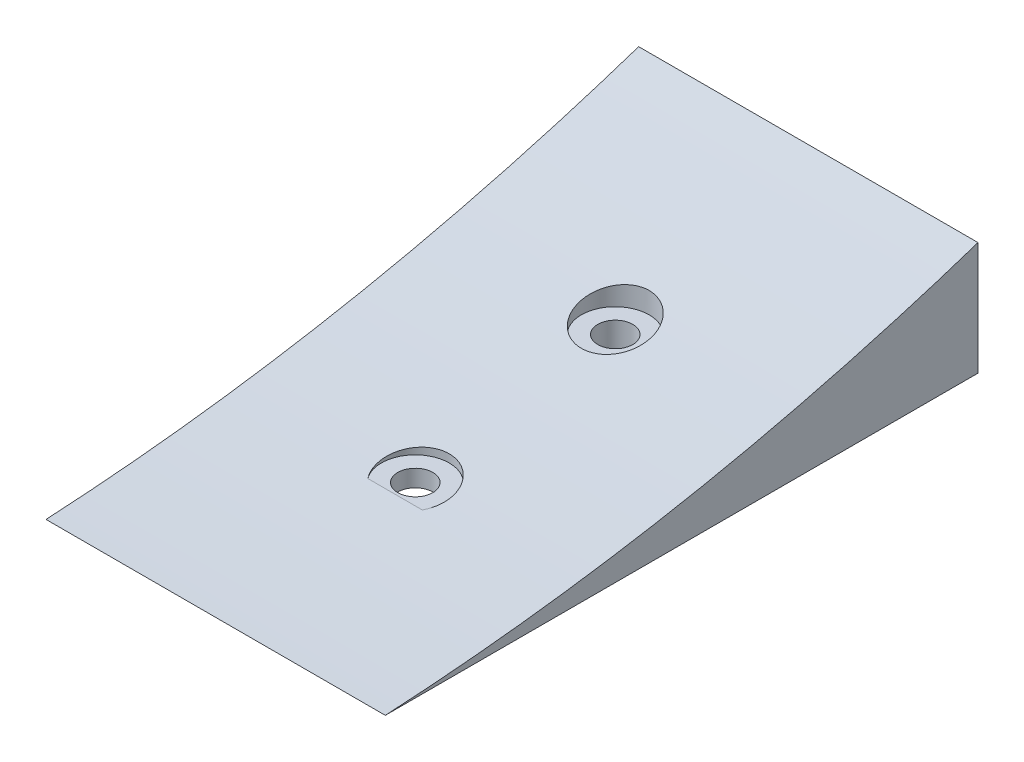
ISO-10303-21;
HEADER;
FILE_DESCRIPTION(('STEP AP214'),'2;1');
FILE_NAME('part.step','',(''),(''),'','','');
FILE_SCHEMA(('AUTOMOTIVE_DESIGN { 1 0 10303 214 1 1 1 1 }'));
ENDSEC;
DATA;
#1=APPLICATION_CONTEXT('core data for automotive mechanical design processes');
#2=APPLICATION_PROTOCOL_DEFINITION('international standard','automotive_design',2000,#1);
#3=PRODUCT_CONTEXT('',#1,'mechanical');
#4=PRODUCT('Part','Part','',(#3));
#5=PRODUCT_RELATED_PRODUCT_CATEGORY('part','',(#4));
#6=PRODUCT_DEFINITION_FORMATION('','',#4);
#7=PRODUCT_DEFINITION_CONTEXT('part definition',#1,'design');
#8=PRODUCT_DEFINITION('design','',#6,#7);
#9=PRODUCT_DEFINITION_SHAPE('','',#8);
#10=(LENGTH_UNIT() NAMED_UNIT(*) SI_UNIT(.MILLI.,.METRE.));
#11=(NAMED_UNIT(*) PLANE_ANGLE_UNIT() SI_UNIT($,.RADIAN.));
#12=(NAMED_UNIT(*) SI_UNIT($,.STERADIAN.) SOLID_ANGLE_UNIT());
#13=UNCERTAINTY_MEASURE_WITH_UNIT(LENGTH_MEASURE(1.E-05),#10,'distance_accuracy_value','');
#14=(GEOMETRIC_REPRESENTATION_CONTEXT(3) GLOBAL_UNCERTAINTY_ASSIGNED_CONTEXT((#13)) GLOBAL_UNIT_ASSIGNED_CONTEXT((#10,
#11,#12)) REPRESENTATION_CONTEXT('',''));
#15=CARTESIAN_POINT('',(0.,0.,0.));
#16=DIRECTION('',(0.,0.,1.));
#17=DIRECTION('',(1.,0.,0.));
#18=AXIS2_PLACEMENT_3D('',#15,#16,#17);
#19=CARTESIAN_POINT('',(0.,10.,0.));
#20=DIRECTION('',(1.,0.,0.));
#21=DIRECTION('',(0.,0.,-1.));
#22=AXIS2_PLACEMENT_3D('',#19,#20,#21);
#23=PLANE('',#22);
#24=DIRECTION('',(0.,0.,1.));
#25=VECTOR('',#24,1.);
#26=CARTESIAN_POINT('',(0.,0.,0.));
#27=LINE('',#26,#25);
#28=CARTESIAN_POINT('',(0.,0.,-52.4));
#29=VERTEX_POINT('',#28);
#30=CARTESIAN_POINT('',(0.,0.,0.));
#31=VERTEX_POINT('',#30);
#32=EDGE_CURVE('E122',#29,#31,#27,.T.);
#33=ORIENTED_EDGE('',*,*,#32,.T.);
#34=CARTESIAN_POINT('',(0.,0.,0.));
#35=CARTESIAN_POINT('',(0.,1.46483217318172,-26.7975723931708));
#36=CARTESIAN_POINT('',(0.,10.,-52.4));
#37=B_SPLINE_CURVE_WITH_KNOTS('',2,(#34,#35,#36),.UNSPECIFIED.,.F.,.F.,(3,3),(0.,1.),.UNSPECIFIED.);
#38=CARTESIAN_POINT('',(0.,10.,-52.4));
#39=VERTEX_POINT('',#38);
#40=EDGE_CURVE('E107',#31,#39,#37,.T.);
#41=ORIENTED_EDGE('',*,*,#40,.T.);
#42=DIRECTION('',(0.,-1.,0.));
#43=VECTOR('',#42,1.);
#44=CARTESIAN_POINT('',(0.,10.,-52.4));
#45=LINE('',#44,#43);
#46=EDGE_CURVE('E112',#39,#29,#45,.T.);
#47=ORIENTED_EDGE('',*,*,#46,.T.);
#48=EDGE_LOOP('',(#33,#41,#47));
#49=FACE_BOUND('',#48,.T.);
#50=ADVANCED_FACE('F33',(#49),#23,.F.);
#51=CARTESIAN_POINT('',(30.,10.,0.));
#52=DIRECTION('',(-1.,0.,0.));
#53=DIRECTION('',(0.,0.,1.));
#54=AXIS2_PLACEMENT_3D('',#51,#52,#53);
#55=PLANE('',#54);
#56=DIRECTION('',(0.,-1.,0.));
#57=VECTOR('',#56,1.);
#58=CARTESIAN_POINT('',(30.,10.,-52.4));
#59=LINE('',#58,#57);
#60=CARTESIAN_POINT('',(30.,10.,-52.4));
#61=VERTEX_POINT('',#60);
#62=CARTESIAN_POINT('',(30.,0.,-52.4));
#63=VERTEX_POINT('',#62);
#64=EDGE_CURVE('E46',#61,#63,#59,.T.);
#65=ORIENTED_EDGE('',*,*,#64,.F.);
#66=CARTESIAN_POINT('',(30.,0.,0.));
#67=CARTESIAN_POINT('',(30.,1.46483217318172,-26.7975723931708));
#68=CARTESIAN_POINT('',(30.,10.,-52.4));
#69=B_SPLINE_CURVE_WITH_KNOTS('',2,(#66,#67,#68),.UNSPECIFIED.,.F.,.F.,(3,3),(0.,1.),.UNSPECIFIED.);
#70=CARTESIAN_POINT('',(30.,0.,0.));
#71=VERTEX_POINT('',#70);
#72=EDGE_CURVE('E98',#71,#61,#69,.T.);
#73=ORIENTED_EDGE('',*,*,#72,.F.);
#74=DIRECTION('',(0.,0.,-1.));
#75=VECTOR('',#74,1.);
#76=CARTESIAN_POINT('',(30.,0.,0.));
#77=LINE('',#76,#75);
#78=EDGE_CURVE('E111',#71,#63,#77,.T.);
#79=ORIENTED_EDGE('',*,*,#78,.T.);
#80=EDGE_LOOP('',(#65,#73,#79));
#81=FACE_BOUND('',#80,.T.);
#82=ADVANCED_FACE('F110',(#81),#55,.F.);
#83=CARTESIAN_POINT('',(0.,10.,-52.4));
#84=DIRECTION('',(0.,0.,1.));
#85=DIRECTION('',(1.,0.,0.));
#86=AXIS2_PLACEMENT_3D('',#83,#84,#85);
#87=PLANE('',#86);
#88=DIRECTION('',(-1.,0.,0.));
#89=VECTOR('',#88,1.);
#90=CARTESIAN_POINT('',(0.,0.,-52.4));
#91=LINE('',#90,#89);
#92=EDGE_CURVE('E60',#63,#29,#91,.T.);
#93=ORIENTED_EDGE('',*,*,#92,.T.);
#94=ORIENTED_EDGE('',*,*,#46,.F.);
#95=DIRECTION('',(-1.,0.,0.));
#96=VECTOR('',#95,1.);
#97=CARTESIAN_POINT('',(0.,10.,-52.4));
#98=LINE('',#97,#96);
#99=EDGE_CURVE('E101',#61,#39,#98,.T.);
#100=ORIENTED_EDGE('',*,*,#99,.F.);
#101=ORIENTED_EDGE('',*,*,#64,.T.);
#102=EDGE_LOOP('',(#93,#94,#100,#101));
#103=FACE_BOUND('',#102,.T.);
#104=ADVANCED_FACE('F114',(#103),#87,.F.);
#105=CARTESIAN_POINT('',(0.,0.,0.));
#106=DIRECTION('',(0.,-1.,0.));
#107=DIRECTION('',(0.,0.,-1.));
#108=AXIS2_PLACEMENT_3D('',#105,#106,#107);
#109=PLANE('',#108);
#110=CARTESIAN_POINT('',(15.,0.,-35.33));
#111=DIRECTION('',(0.,-1.,0.));
#112=DIRECTION('',(0.,0.,-1.));
#113=AXIS2_PLACEMENT_3D('',#110,#111,#112);
#114=CIRCLE('',#113,1.55);
#115=CARTESIAN_POINT('',(15.,0.,-36.88));
#116=VERTEX_POINT('',#115);
#117=EDGE_CURVE('E108',#116,#116,#114,.T.);
#118=ORIENTED_EDGE('',*,*,#117,.F.);
#119=EDGE_LOOP('',(#118));
#120=FACE_BOUND('',#119,.T.);
#121=CARTESIAN_POINT('',(15.,0.,-17.65));
#122=DIRECTION('',(0.,-1.,0.));
#123=DIRECTION('',(0.,0.,-1.));
#124=AXIS2_PLACEMENT_3D('',#121,#122,#123);
#125=CIRCLE('',#124,1.55);
#126=CARTESIAN_POINT('',(15.,0.,-19.2));
#127=VERTEX_POINT('',#126);
#128=EDGE_CURVE('E130',#127,#127,#125,.T.);
#129=ORIENTED_EDGE('',*,*,#128,.F.);
#130=EDGE_LOOP('',(#129));
#131=FACE_BOUND('',#130,.T.);
#132=ORIENTED_EDGE('',*,*,#32,.F.);
#133=ORIENTED_EDGE('',*,*,#92,.F.);
#134=ORIENTED_EDGE('',*,*,#78,.F.);
#135=DIRECTION('',(1.,0.,0.));
#136=VECTOR('',#135,1.);
#137=CARTESIAN_POINT('',(0.,0.,0.));
#138=LINE('',#137,#136);
#139=EDGE_CURVE('E104',#31,#71,#138,.T.);
#140=ORIENTED_EDGE('',*,*,#139,.F.);
#141=EDGE_LOOP('',(#132,#133,#134,#140));
#142=FACE_BOUND('',#141,.T.);
#143=ADVANCED_FACE('F92',(#120,#131,#142),#109,.T.);
#144=DIRECTION('',(1.,0.,0.));
#145=VECTOR('',#144,1.);
#146=SURFACE_OF_LINEAR_EXTRUSION('',#37,#145);
#147=DIRECTION('',(1.,0.,0.));
#148=VECTOR('',#147,1.);
#149=CARTESIAN_POINT('',(0.,1.5,-15.8584519694367));
#150=LINE('',#149,#148);
#151=CARTESIAN_POINT('',(17.4063157843859,1.5,-15.8584519694367));
#152=VERTEX_POINT('',#151);
#153=CARTESIAN_POINT('',(12.5936842156141,1.5,-15.8584519694367));
#154=VERTEX_POINT('',#153);
#155=EDGE_CURVE('E79',#152,#154,#150,.F.);
#156=ORIENTED_EDGE('',*,*,#155,.T.);
#157=CARTESIAN_POINT('',(12.5936842156141,1.5,-15.8584519694367));
#158=CARTESIAN_POINT('',(12.5428656586624,1.50921584644328,-15.9266952350148));
#159=CARTESIAN_POINT('',(12.4949878869282,1.51875721333754,-15.9970772347503));
#160=CARTESIAN_POINT('',(12.4054113743887,1.53843018439872,-16.1415824943681));
#161=CARTESIAN_POINT('',(12.3637120765417,1.54856173524066,-16.2157054161657));
#162=CARTESIAN_POINT('',(12.2868172003703,1.56934608838711,-16.3670969483702));
#163=CARTESIAN_POINT('',(12.251615487735,1.57999838691333,-16.4443625068475));
#164=CARTESIAN_POINT('',(12.1879039660042,1.60176235635777,-16.6015176882954));
#165=CARTESIAN_POINT('',(12.1593941545142,1.61287402711161,-16.6814073103271));
#166=CARTESIAN_POINT('',(12.0842003005566,1.64680212650276,-16.9242179986155));
#167=CARTESIAN_POINT('',(12.0478032519005,1.67022479329615,-17.0903768440814));
#168=CARTESIAN_POINT('',(12.0035616126467,1.71801355647811,-17.4262075460633));
#169=CARTESIAN_POINT('',(11.9957144810499,1.74237956871198,-17.5958790885906));
#170=CARTESIAN_POINT('',(12.0087277094615,1.79152367363727,-17.9349608823447));
#171=CARTESIAN_POINT('',(12.0297333978676,1.81630322683634,-18.1043654763324));
#172=CARTESIAN_POINT('',(12.1001404985521,1.86542518092064,-18.437254244342));
#173=CARTESIAN_POINT('',(12.1495460676216,1.88976751727398,-18.600737547961));
#174=CARTESIAN_POINT('',(12.2755093686103,1.93729520705006,-18.9173682133374));
#175=CARTESIAN_POINT('',(12.3521082815158,1.9604787445311,-19.0704994771846));
#176=CARTESIAN_POINT('',(12.5303552879193,2.00488686107001,-19.3617235165053));
#177=CARTESIAN_POINT('',(12.6320014691809,2.0261115895034,-19.4998174388462));
#178=CARTESIAN_POINT('',(12.8569007687183,2.06575693228134,-19.756190386392));
#179=CARTESIAN_POINT('',(12.9800286807176,2.08419269905784,-19.8745768630236));
#180=CARTESIAN_POINT('',(13.244849384672,2.11773851550883,-20.0889469526342));
#181=CARTESIAN_POINT('',(13.3865414178943,2.13284870103528,-20.1849314807557));
#182=CARTESIAN_POINT('',(13.6828026000245,2.15902865741914,-20.3506448019885));
#183=CARTESIAN_POINT('',(13.8372126955295,2.17014110486035,-20.4206511870503));
#184=CARTESIAN_POINT('',(14.1558278413402,2.18813051009957,-20.5337377024873));
#185=CARTESIAN_POINT('',(14.320032168484,2.19500778018039,-20.5768198181397));
#186=CARTESIAN_POINT('',(14.6516487206042,2.20420679020125,-20.634403672983));
#187=CARTESIAN_POINT('',(14.8190063404277,2.20657745263682,-20.6492123486316));
#188=CARTESIAN_POINT('',(15.153848500953,2.20681964099681,-20.6507262461003));
#189=CARTESIAN_POINT('',(15.3213330365889,2.20469133792336,-20.6374325360698));
#190=CARTESIAN_POINT('',(15.6508309576127,2.19604004447083,-20.5832851400289));
#191=CARTESIAN_POINT('',(15.8128668517725,2.18953831902175,-20.5425648094678));
#192=CARTESIAN_POINT('',(16.1277578432003,2.17241002848718,-20.4349325083044));
#193=CARTESIAN_POINT('',(16.280612787444,2.16178339467145,-20.3680201012833));
#194=CARTESIAN_POINT('',(16.5734891974275,2.13675084777493,-20.2096784781845));
#195=CARTESIAN_POINT('',(16.7134575262714,2.12233015662256,-20.118153362662));
#196=CARTESIAN_POINT('',(16.9760568729877,2.09025092039349,-19.913387982173));
#197=CARTESIAN_POINT('',(17.0986873794917,2.07259227985074,-19.8001470769446));
#198=CARTESIAN_POINT('',(17.3245096755595,2.03445003084073,-19.5539040786118));
#199=CARTESIAN_POINT('',(17.4274861797418,2.01393896842482,-19.4207088288997));
#200=CARTESIAN_POINT('',(17.609660949545,1.97092185844357,-19.1392219677846));
#201=CARTESIAN_POINT('',(17.6888561944578,1.94841555791191,-18.9909284417913));
#202=CARTESIAN_POINT('',(17.822125197145,1.90186414549719,-18.6816414073678));
#203=CARTESIAN_POINT('',(17.875904212639,1.87780448991616,-18.5205230618939));
#204=CARTESIAN_POINT('',(17.9555468393725,1.82912630274967,-18.1916308352775));
#205=CARTESIAN_POINT('',(17.9814137676465,1.80450783792745,-18.0238577474329));
#206=CARTESIAN_POINT('',(18.0046242815642,1.75527048173654,-17.6852265064746));
#207=CARTESIAN_POINT('',(18.0017778780788,1.73065266678315,-17.5143552818565));
#208=CARTESIAN_POINT('',(17.9671004502628,1.68225610705812,-17.1753239148758));
#209=CARTESIAN_POINT('',(17.9352621982519,1.65847757305516,-17.0071644591979));
#210=CARTESIAN_POINT('',(17.8647496663913,1.62308813092542,-16.7546507125838));
#211=CARTESIAN_POINT('',(17.8360299777871,1.61093134421571,-16.6674723703875));
#212=CARTESIAN_POINT('',(17.7706919379743,1.58713501164367,-16.4960189454079));
#213=CARTESIAN_POINT('',(17.7340729743425,1.57549550597006,-16.4117440883169));
#214=CARTESIAN_POINT('',(17.6531540781852,1.55280532504552,-16.2467062325327));
#215=CARTESIAN_POINT('',(17.6088410113615,1.54175569962829,-16.1659495393398));
#216=CARTESIAN_POINT('',(17.5129416157205,1.52034329938619,-16.0087756371168));
#217=CARTESIAN_POINT('',(17.4613549276129,1.50998055852811,-15.9323586427135));
#218=CARTESIAN_POINT('',(17.4063157843859,1.5,-15.8584519694367));
#219=B_SPLINE_CURVE_WITH_KNOTS('',3,(#157,#158,#159,#160,#161,#162,#163,#164,#165,#166,#167,
#168,#169,#170,#171,#172,#173,#174,#175,#176,#177,#178,#179,#180,#181,#182,#183,#184,#185,#186,
#187,#188,#189,#190,#191,#192,#193,#194,#195,#196,#197,#198,#199,#200,#201,#202,#203,#204,#205,
#206,#207,#208,#209,#210,#211,#212,#213,#214,#215,#216,#217,#218),.UNSPECIFIED.,.F.,.F.,(4,2,2,
2,2,2,2,2,2,2,2,2,2,2,2,2,2,2,2,2,2,2,2,2,2,2,2,2,2,2,4),(0.,0.256664941409219,
0.513306728199344,0.769704968508425,1.02610311707711,1.53857842383788,2.05100811816777,
2.56602834948328,3.0811239817076,3.59700301417578,4.1128426740013,4.62577050832913,
5.13867738536136,5.64593393761771,6.15315308259069,6.65483383247216,7.1564955142067,
7.65573542673489,8.1549836580785,8.65620604384817,9.15744320978214,9.66389002832648,
10.1704011488251,10.6826500923427,11.1948381541856,11.710417451022,12.2261253171988,
12.5035667252268,12.7810296507553,13.0589709644538,13.3369260122534),.UNSPECIFIED.);
#220=EDGE_CURVE('E11',#154,#152,#219,.T.);
#221=ORIENTED_EDGE('',*,*,#220,.T.);
#222=EDGE_LOOP('',(#156,#221));
#223=FACE_BOUND('',#222,.T.);
#224=CARTESIAN_POINT('',(15.,5.86623354935667,-38.33));
#225=CARTESIAN_POINT('',(15.1647180601281,5.86623133201718,-38.3299920514101));
#226=CARTESIAN_POINT('',(15.3295588223282,5.86276290509084,-38.3163811085625));
#227=CARTESIAN_POINT('',(15.6546272949316,5.84901205025036,-38.2623499892137));
#228=CARTESIAN_POINT('',(15.814849109084,5.83872128324089,-38.2218970030438));
#229=CARTESIAN_POINT('',(16.1258453758175,5.81173294746736,-38.1155764646656));
#230=CARTESIAN_POINT('',(16.2766305595634,5.79504281581044,-38.0497384135546));
#231=CARTESIAN_POINT('',(16.5648282305035,5.75587458805418,-37.894777831243));
#232=CARTESIAN_POINT('',(16.702243215074,5.73339757573848,-37.8056596599646));
#233=CARTESIAN_POINT('',(16.9620337979301,5.68308471154575,-37.6054538007149));
#234=CARTESIAN_POINT('',(17.0841721130658,5.65517829189708,-37.4940762145607));
#235=CARTESIAN_POINT('',(17.3081098258104,5.5951450239251,-37.2534486322229));
#236=CARTESIAN_POINT('',(17.4099058571958,5.5630174785491,-37.124195684018));
#237=CARTESIAN_POINT('',(17.5933887024091,5.49455990584767,-36.847460368217));
#238=CARTESIAN_POINT('',(17.6744068825233,5.45813503876609,-36.6995581086295));
#239=CARTESIAN_POINT('',(17.8104526088605,5.38298784895169,-36.3927898028971));
#240=CARTESIAN_POINT('',(17.865476420993,5.34426519704084,-36.2339221853331));
#241=CARTESIAN_POINT('',(17.9492998775235,5.2646395273565,-35.9054000413593));
#242=CARTESIAN_POINT('',(17.9774006968654,5.22370613129331,-35.7355742830924));
#243=CARTESIAN_POINT('',(18.0042253223181,5.1417711920233,-35.3936273446507));
#244=CARTESIAN_POINT('',(18.0029467546644,5.1007696435776,-35.2215059801208));
#245=CARTESIAN_POINT('',(17.9708101101742,5.01940517509964,-34.8779298874495));
#246=CARTESIAN_POINT('',(17.9396380176256,4.9790536629401,-34.7065016553252));
#247=CARTESIAN_POINT('',(17.8479465903462,4.90056652147541,-34.3711379540951));
#248=CARTESIAN_POINT('',(17.7874276891554,4.86243085944484,-34.2072023743396));
#249=CARTESIAN_POINT('',(17.6390909378575,4.7897154118385,-33.8929348514116));
#250=CARTESIAN_POINT('',(17.5514877615586,4.75511041419295,-33.742507533346));
#251=CARTESIAN_POINT('',(17.3510772105857,4.69008003201684,-33.4584670698052));
#252=CARTESIAN_POINT('',(17.2382725772658,4.65965419346826,-33.3248520979925));
#253=CARTESIAN_POINT('',(16.9931862830362,4.60443115663873,-33.0813531726286));
#254=CARTESIAN_POINT('',(16.8613706254516,4.57952787858792,-32.9710243946838));
#255=CARTESIAN_POINT('',(16.580212141779,4.53522937041781,-32.7741502717133));
#256=CARTESIAN_POINT('',(16.4308718727654,4.51583333812679,-32.687601463016));
#257=CARTESIAN_POINT('',(16.1229029092856,4.48350080673299,-32.5430106916333));
#258=CARTESIAN_POINT('',(15.9645970170077,4.4704158433955,-32.4843141218002));
#259=CARTESIAN_POINT('',(15.6400285935215,4.45035800640151,-32.3942347928584));
#260=CARTESIAN_POINT('',(15.4737670055399,4.44338441006606,-32.3628488042327));
#261=CARTESIAN_POINT('',(15.1412578525229,4.43581005194479,-32.3287549573548));
#262=CARTESIAN_POINT('',(14.9750651645118,4.43509555396538,-32.3255352809977));
#263=CARTESIAN_POINT('',(14.6445155679246,4.43976020652274,-32.3465367650942));
#264=CARTESIAN_POINT('',(14.4801585681721,4.4451390530386,-32.3707565564848));
#265=CARTESIAN_POINT('',(14.1588030841802,4.46180311367164,-32.445650772375));
#266=CARTESIAN_POINT('',(14.0017711463682,4.47305785529096,-32.4961887071181));
#267=CARTESIAN_POINT('',(13.6985134188992,4.50116078036305,-32.6220327950152));
#268=CARTESIAN_POINT('',(13.5522879241297,4.51800911638564,-32.6973396237602));
#269=CARTESIAN_POINT('',(13.2732622305162,4.55704810417121,-32.8712096483409));
#270=CARTESIAN_POINT('',(13.1406001289863,4.57928716751214,-32.9699834202109));
#271=CARTESIAN_POINT('',(12.8937296358278,4.62845258788932,-33.1874107134979));
#272=CARTESIAN_POINT('',(12.7795229264498,4.65537937175767,-33.3060660451583));
#273=CARTESIAN_POINT('',(12.5702656905927,4.71383944605408,-33.5624243276045));
#274=CARTESIAN_POINT('',(12.47565564043,4.7454558214404,-33.7004677582973));
#275=CARTESIAN_POINT('',(12.3108892886682,4.81205874139401,-33.9897029156088));
#276=CARTESIAN_POINT('',(12.2407360116261,4.84704570211752,-34.1408962655847));
#277=CARTESIAN_POINT('',(12.1250841106864,4.92039754969742,-34.4560881107452));
#278=CARTESIAN_POINT('',(12.0802327565787,4.95882426115884,-34.6203097933221));
#279=CARTESIAN_POINT('',(12.0188854358892,5.03727501045636,-34.9535990983276));
#280=CARTESIAN_POINT('',(12.0023928864958,5.07729924019626,-35.1226673022589));
#281=CARTESIAN_POINT('',(11.9980508224822,5.1586503812481,-35.4642940241613));
#282=CARTESIAN_POINT('',(12.0107560416208,5.1999875597767,-35.6368573630438));
#283=CARTESIAN_POINT('',(12.0656142556037,5.28203622338632,-35.9774021115191));
#284=CARTESIAN_POINT('',(12.1077690292931,5.32274767051939,-36.1453832436953));
#285=CARTESIAN_POINT('',(12.2207593604852,5.40252421295245,-36.4727818216416));
#286=CARTESIAN_POINT('',(12.2917303863104,5.44158055617592,-36.6321547331016));
#287=CARTESIAN_POINT('',(12.4605811919758,5.51659332370008,-36.9367567866568));
#288=CARTESIAN_POINT('',(12.5584586419041,5.55255001605532,-37.0819871519256));
#289=CARTESIAN_POINT('',(12.777027561933,5.61966243856411,-37.3519122900521));
#290=CARTESIAN_POINT('',(12.8973798504619,5.65087842392721,-37.4768664834619));
#291=CARTESIAN_POINT('',(13.1585825426894,5.70799032661177,-37.7047004299778));
#292=CARTESIAN_POINT('',(13.2994350406047,5.73388569974889,-37.8075779251598));
#293=CARTESIAN_POINT('',(13.5934988056734,5.77872781030064,-37.9852732677435));
#294=CARTESIAN_POINT('',(13.7462687715536,5.79784465059536,-38.0607792725214));
#295=CARTESIAN_POINT('',(14.0628551017755,5.82932570382872,-38.1849222942563));
#296=CARTESIAN_POINT('',(14.2266549486511,5.84169977219046,-38.23359852756));
#297=CARTESIAN_POINT('',(14.4930769912232,5.85569587792203,-38.2886168639931));
#298=CARTESIAN_POINT('',(14.5937793317913,5.85964101245016,-38.3041129234673));
#299=CARTESIAN_POINT('',(14.7963054828953,5.86491051289882,-38.324806867146));
#300=CARTESIAN_POINT('',(14.8981292754916,5.86623492068159,-38.330004915846));
#301=CARTESIAN_POINT('',(15.,5.86623354935667,-38.33));
#302=B_SPLINE_CURVE_WITH_KNOTS('',3,(#224,#225,#226,#227,#228,#229,#230,#231,#232,#233,#234,
#235,#236,#237,#238,#239,#240,#241,#242,#243,#244,#245,#246,#247,#248,#249,#250,#251,#252,#253,
#254,#255,#256,#257,#258,#259,#260,#261,#262,#263,#264,#265,#266,#267,#268,#269,#270,#271,#272,
#273,#274,#275,#276,#277,#278,#279,#280,#281,#282,#283,#284,#285,#286,#287,#288,#289,#290,#291,
#292,#293,#294,#295,#296,#297,#298,#299,#300,#301),.UNSPECIFIED.,.T.,.F.,(4,2,2,2,2,2,2,2,2,2,2,
2,2,2,2,2,2,2,2,2,2,2,2,2,2,2,2,2,2,2,2,2,2,2,2,2,2,2,4),(0.,0.493775731833126,
0.988156132076907,1.48196371453017,1.97567888246813,2.47630079255544,2.97700547664747,
3.49222782369932,4.0075241599472,4.53585986352734,5.06423825516439,5.59822848173071,
6.13221081990467,6.66206477951588,7.19186113092501,7.71037359888733,8.2288105028251,
8.73437157735195,9.23987286040043,9.7361690188171,10.2324404161572,10.7261633375371,
11.2198997267158,11.7182460546404,12.2166377823649,12.7252419240141,13.2339089421934,
13.7550586034608,14.2762710579904,14.8074677836164,15.3386965979601,15.8724522377791,
16.4061616725672,16.9323866180124,17.4586653582031,17.970604761951,18.481793879914,
18.7871768780835,19.0925549981715),.UNSPECIFIED.);
#303=CARTESIAN_POINT('',(15.,5.86623354935667,-38.33));
#304=VERTEX_POINT('',#303);
#305=EDGE_CURVE('E96',#304,#304,#302,.T.);
#306=ORIENTED_EDGE('',*,*,#305,.T.);
#307=EDGE_LOOP('',(#306));
#308=FACE_BOUND('',#307,.T.);
#309=ORIENTED_EDGE('',*,*,#72,.T.);
#310=ORIENTED_EDGE('',*,*,#99,.T.);
#311=ORIENTED_EDGE('',*,*,#40,.F.);
#312=ORIENTED_EDGE('',*,*,#139,.T.);
#313=EDGE_LOOP('',(#309,#310,#311,#312));
#314=FACE_BOUND('',#313,.T.);
#315=ADVANCED_FACE('F88',(#223,#308,#314),#146,.F.);
#316=CARTESIAN_POINT('',(15.,14.,-17.65));
#317=DIRECTION('',(0.,-1.,0.));
#318=DIRECTION('',(0.,0.,-1.));
#319=AXIS2_PLACEMENT_3D('',#316,#317,#318);
#320=CYLINDRICAL_SURFACE('',#319,1.55);
#321=CARTESIAN_POINT('',(15.,1.5,-17.65));
#322=DIRECTION('',(0.,-1.,0.));
#323=DIRECTION('',(0.,0.,-1.));
#324=AXIS2_PLACEMENT_3D('',#321,#322,#323);
#325=CIRCLE('',#324,1.55);
#326=CARTESIAN_POINT('',(15.,1.5,-19.2));
#327=VERTEX_POINT('',#326);
#328=EDGE_CURVE('E86',#327,#327,#325,.T.);
#329=ORIENTED_EDGE('',*,*,#328,.F.);
#330=EDGE_LOOP('',(#329));
#331=FACE_BOUND('',#330,.T.);
#332=ORIENTED_EDGE('',*,*,#128,.T.);
#333=EDGE_LOOP('',(#332));
#334=FACE_BOUND('',#333,.T.);
#335=ADVANCED_FACE('F91',(#331,#334),#320,.F.);
#336=CARTESIAN_POINT('',(15.,14.,-35.33));
#337=DIRECTION('',(0.,-1.,0.));
#338=DIRECTION('',(0.,0.,-1.));
#339=AXIS2_PLACEMENT_3D('',#336,#337,#338);
#340=CYLINDRICAL_SURFACE('',#339,1.55);
#341=CARTESIAN_POINT('',(15.,4.,-35.33));
#342=DIRECTION('',(0.,-1.,0.));
#343=DIRECTION('',(0.,0.,-1.));
#344=AXIS2_PLACEMENT_3D('',#341,#342,#343);
#345=CIRCLE('',#344,1.55);
#346=CARTESIAN_POINT('',(15.,4.,-36.88));
#347=VERTEX_POINT('',#346);
#348=EDGE_CURVE('E82',#347,#347,#345,.T.);
#349=ORIENTED_EDGE('',*,*,#348,.F.);
#350=EDGE_LOOP('',(#349));
#351=FACE_BOUND('',#350,.T.);
#352=ORIENTED_EDGE('',*,*,#117,.T.);
#353=EDGE_LOOP('',(#352));
#354=FACE_BOUND('',#353,.T.);
#355=ADVANCED_FACE('F141',(#351,#354),#340,.F.);
#356=CARTESIAN_POINT('',(15.,16.,-35.33));
#357=DIRECTION('',(0.,-1.,0.));
#358=DIRECTION('',(0.,0.,-1.));
#359=AXIS2_PLACEMENT_3D('',#356,#357,#358);
#360=CYLINDRICAL_SURFACE('',#359,3.);
#361=CARTESIAN_POINT('',(15.,4.,-35.33));
#362=DIRECTION('',(0.,-1.,0.));
#363=DIRECTION('',(0.,0.,-1.));
#364=AXIS2_PLACEMENT_3D('',#361,#362,#363);
#365=CIRCLE('',#364,3.);
#366=CARTESIAN_POINT('',(15.,4.,-38.33));
#367=VERTEX_POINT('',#366);
#368=EDGE_CURVE('E131',#367,#367,#365,.T.);
#369=ORIENTED_EDGE('',*,*,#368,.T.);
#370=EDGE_LOOP('',(#369));
#371=FACE_BOUND('',#370,.T.);
#372=ORIENTED_EDGE('',*,*,#305,.F.);
#373=EDGE_LOOP('',(#372));
#374=FACE_BOUND('',#373,.T.);
#375=ADVANCED_FACE('F135',(#371,#374),#360,.F.);
#376=CARTESIAN_POINT('',(0.,4.,0.));
#377=DIRECTION('',(0.,-1.,0.));
#378=DIRECTION('',(0.,0.,-1.));
#379=AXIS2_PLACEMENT_3D('',#376,#377,#378);
#380=PLANE('',#379);
#381=ORIENTED_EDGE('',*,*,#348,.T.);
#382=EDGE_LOOP('',(#381));
#383=FACE_BOUND('',#382,.T.);
#384=ORIENTED_EDGE('',*,*,#368,.F.);
#385=EDGE_LOOP('',(#384));
#386=FACE_BOUND('',#385,.T.);
#387=ADVANCED_FACE('F140',(#383,#386),#380,.F.);
#388=CARTESIAN_POINT('',(15.,10.,-17.65));
#389=DIRECTION('',(0.,-1.,0.));
#390=DIRECTION('',(0.,0.,-1.));
#391=AXIS2_PLACEMENT_3D('',#388,#389,#390);
#392=CYLINDRICAL_SURFACE('',#391,3.);
#393=CARTESIAN_POINT('',(15.,1.5,-17.65));
#394=DIRECTION('',(0.,-1.,0.));
#395=DIRECTION('',(0.,0.,-1.));
#396=AXIS2_PLACEMENT_3D('',#393,#394,#395);
#397=CIRCLE('',#396,3.);
#398=EDGE_CURVE('E52',#154,#152,#397,.T.);
#399=ORIENTED_EDGE('',*,*,#398,.T.);
#400=ORIENTED_EDGE('',*,*,#220,.F.);
#401=EDGE_LOOP('',(#399,#400));
#402=FACE_BOUND('',#401,.T.);
#403=ADVANCED_FACE('F85',(#402),#392,.F.);
#404=CARTESIAN_POINT('',(0.,1.5,0.));
#405=DIRECTION('',(0.,-1.,0.));
#406=DIRECTION('',(0.,0.,-1.));
#407=AXIS2_PLACEMENT_3D('',#404,#405,#406);
#408=PLANE('',#407);
#409=ORIENTED_EDGE('',*,*,#328,.T.);
#410=EDGE_LOOP('',(#409));
#411=FACE_BOUND('',#410,.T.);
#412=ORIENTED_EDGE('',*,*,#398,.F.);
#413=ORIENTED_EDGE('',*,*,#155,.F.);
#414=EDGE_LOOP('',(#412,#413));
#415=FACE_BOUND('',#414,.T.);
#416=ADVANCED_FACE('F80',(#411,#415),#408,.F.);
#417=CLOSED_SHELL('',(#50,#82,#104,#143,#315,#335,#355,#375,#387,#403,#416));
#418=MANIFOLD_SOLID_BREP('B2',#417);
#419=ADVANCED_BREP_SHAPE_REPRESENTATION('',(#18,#418),#14);
#420=SHAPE_DEFINITION_REPRESENTATION(#9,#419);
ENDSEC;
END-ISO-10303-21;
